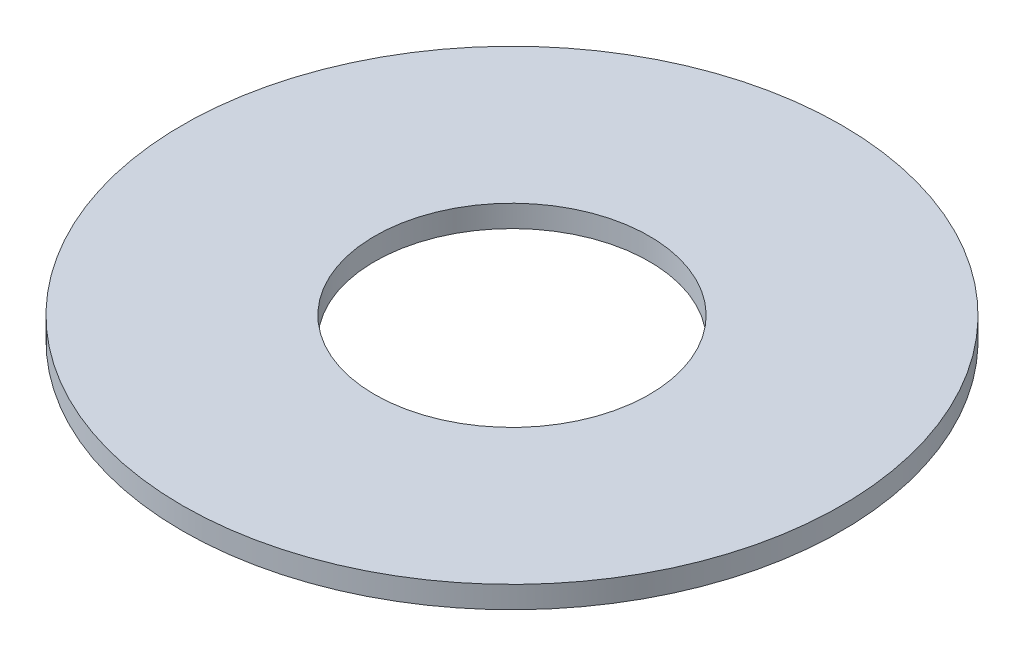
ISO-10303-21;
HEADER;
FILE_DESCRIPTION(('STEP AP214'),'2;1');
FILE_NAME('part.step','',(''),(''),'','','');
FILE_SCHEMA(('AUTOMOTIVE_DESIGN { 1 0 10303 214 1 1 1 1 }'));
ENDSEC;
DATA;
#1=APPLICATION_CONTEXT('core data for automotive mechanical design processes');
#2=APPLICATION_PROTOCOL_DEFINITION('international standard','automotive_design',2000,#1);
#3=PRODUCT_CONTEXT('',#1,'mechanical');
#4=PRODUCT('Part','Part','',(#3));
#5=PRODUCT_RELATED_PRODUCT_CATEGORY('part','',(#4));
#6=PRODUCT_DEFINITION_FORMATION('','',#4);
#7=PRODUCT_DEFINITION_CONTEXT('part definition',#1,'design');
#8=PRODUCT_DEFINITION('design','',#6,#7);
#9=PRODUCT_DEFINITION_SHAPE('','',#8);
#10=(LENGTH_UNIT() NAMED_UNIT(*) SI_UNIT(.MILLI.,.METRE.));
#11=(NAMED_UNIT(*) PLANE_ANGLE_UNIT() SI_UNIT($,.RADIAN.));
#12=(NAMED_UNIT(*) SI_UNIT($,.STERADIAN.) SOLID_ANGLE_UNIT());
#13=UNCERTAINTY_MEASURE_WITH_UNIT(LENGTH_MEASURE(1.E-05),#10,'distance_accuracy_value','');
#14=(GEOMETRIC_REPRESENTATION_CONTEXT(3) GLOBAL_UNCERTAINTY_ASSIGNED_CONTEXT((#13)) GLOBAL_UNIT_ASSIGNED_CONTEXT((#10,
#11,#12)) REPRESENTATION_CONTEXT('',''));
#15=CARTESIAN_POINT('',(0.,0.,0.));
#16=DIRECTION('',(0.,0.,1.));
#17=DIRECTION('',(1.,0.,0.));
#18=AXIS2_PLACEMENT_3D('',#15,#16,#17);
#19=CARTESIAN_POINT('',(0.,1.,0.));
#20=DIRECTION('',(0.,1.,0.));
#21=DIRECTION('',(0.,0.,1.));
#22=AXIS2_PLACEMENT_3D('',#19,#20,#21);
#23=PLANE('',#22);
#24=CARTESIAN_POINT('',(0.,1.,0.));
#25=DIRECTION('',(0.,1.,0.));
#26=DIRECTION('',(0.,0.,1.));
#27=AXIS2_PLACEMENT_3D('',#24,#25,#26);
#28=CIRCLE('',#27,15.);
#29=CARTESIAN_POINT('',(0.,1.,15.));
#30=VERTEX_POINT('',#29);
#31=EDGE_CURVE('E10',#30,#30,#28,.T.);
#32=ORIENTED_EDGE('',*,*,#31,.T.);
#33=EDGE_LOOP('',(#32));
#34=FACE_BOUND('',#33,.T.);
#35=CARTESIAN_POINT('',(0.,1.,0.));
#36=DIRECTION('',(0.,1.,0.));
#37=DIRECTION('',(0.,0.,1.));
#38=AXIS2_PLACEMENT_3D('',#35,#36,#37);
#39=CIRCLE('',#38,6.25);
#40=CARTESIAN_POINT('',(0.,1.,6.25));
#41=VERTEX_POINT('',#40);
#42=EDGE_CURVE('E42',#41,#41,#39,.T.);
#43=ORIENTED_EDGE('',*,*,#42,.F.);
#44=EDGE_LOOP('',(#43));
#45=FACE_BOUND('',#44,.T.);
#46=ADVANCED_FACE('F31',(#34,#45),#23,.T.);
#47=CARTESIAN_POINT('',(0.,0.,0.));
#48=DIRECTION('',(0.,1.,0.));
#49=DIRECTION('',(0.,0.,1.));
#50=AXIS2_PLACEMENT_3D('',#47,#48,#49);
#51=PLANE('',#50);
#52=CARTESIAN_POINT('',(0.,0.,0.));
#53=DIRECTION('',(0.,1.,0.));
#54=DIRECTION('',(0.,0.,1.));
#55=AXIS2_PLACEMENT_3D('',#52,#53,#54);
#56=CIRCLE('',#55,15.);
#57=CARTESIAN_POINT('',(0.,0.,15.));
#58=VERTEX_POINT('',#57);
#59=EDGE_CURVE('E35',#58,#58,#56,.T.);
#60=ORIENTED_EDGE('',*,*,#59,.F.);
#61=EDGE_LOOP('',(#60));
#62=FACE_BOUND('',#61,.T.);
#63=CARTESIAN_POINT('',(0.,0.,0.));
#64=DIRECTION('',(0.,1.,0.));
#65=DIRECTION('',(0.,0.,1.));
#66=AXIS2_PLACEMENT_3D('',#63,#64,#65);
#67=CIRCLE('',#66,6.25);
#68=CARTESIAN_POINT('',(0.,0.,6.25));
#69=VERTEX_POINT('',#68);
#70=EDGE_CURVE('E44',#69,#69,#67,.T.);
#71=ORIENTED_EDGE('',*,*,#70,.T.);
#72=EDGE_LOOP('',(#71));
#73=FACE_BOUND('',#72,.T.);
#74=ADVANCED_FACE('F54',(#62,#73),#51,.F.);
#75=CARTESIAN_POINT('',(0.,1.,0.));
#76=DIRECTION('',(0.,-1.,0.));
#77=DIRECTION('',(0.,0.,-1.));
#78=AXIS2_PLACEMENT_3D('',#75,#76,#77);
#79=CYLINDRICAL_SURFACE('',#78,15.);
#80=ORIENTED_EDGE('',*,*,#31,.F.);
#81=EDGE_LOOP('',(#80));
#82=FACE_BOUND('',#81,.T.);
#83=ORIENTED_EDGE('',*,*,#59,.T.);
#84=EDGE_LOOP('',(#83));
#85=FACE_BOUND('',#84,.T.);
#86=ADVANCED_FACE('F33',(#82,#85),#79,.T.);
#87=CARTESIAN_POINT('',(0.,1.,0.));
#88=DIRECTION('',(0.,-1.,0.));
#89=DIRECTION('',(0.,0.,-1.));
#90=AXIS2_PLACEMENT_3D('',#87,#88,#89);
#91=CYLINDRICAL_SURFACE('',#90,6.25);
#92=ORIENTED_EDGE('',*,*,#42,.T.);
#93=EDGE_LOOP('',(#92));
#94=FACE_BOUND('',#93,.T.);
#95=ORIENTED_EDGE('',*,*,#70,.F.);
#96=EDGE_LOOP('',(#95));
#97=FACE_BOUND('',#96,.T.);
#98=ADVANCED_FACE('F50',(#94,#97),#91,.F.);
#99=CLOSED_SHELL('',(#46,#74,#86,#98));
#100=MANIFOLD_SOLID_BREP('B2',#99);
#101=ADVANCED_BREP_SHAPE_REPRESENTATION('',(#18,#100),#14);
#102=SHAPE_DEFINITION_REPRESENTATION(#9,#101);
ENDSEC;
END-ISO-10303-21;
